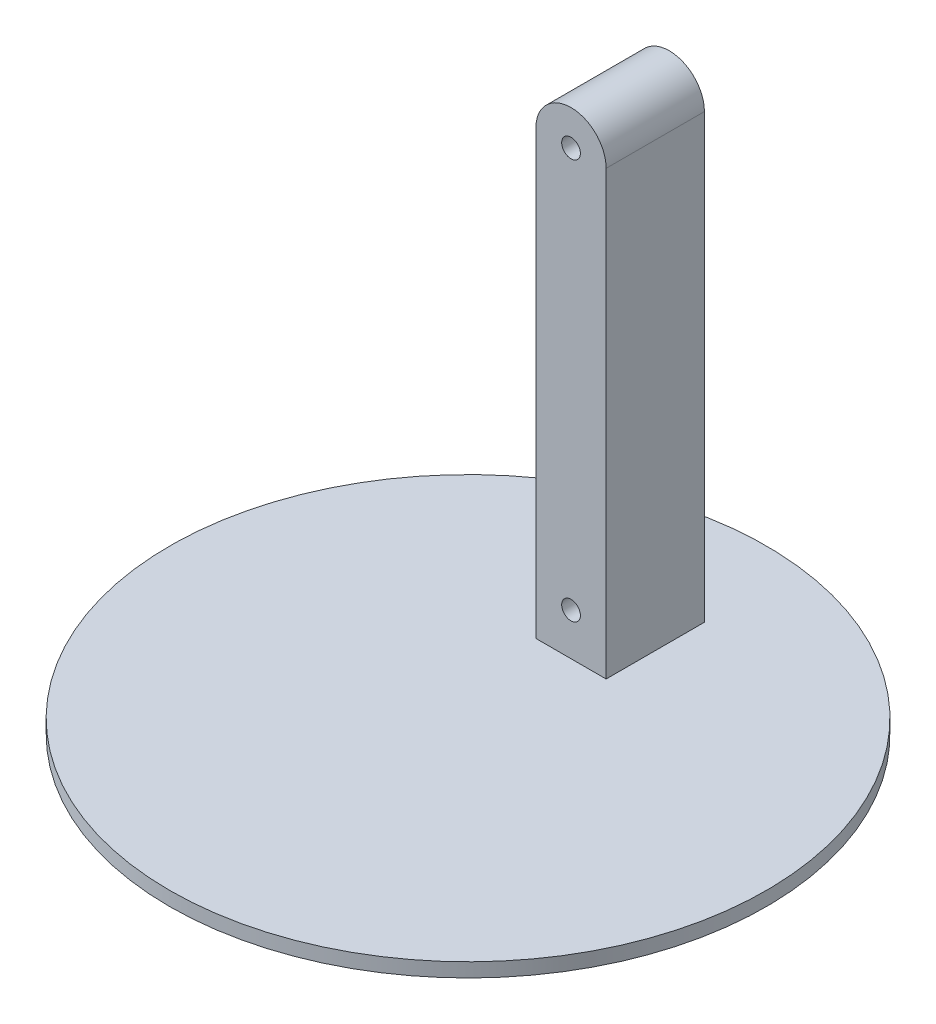
ISO-10303-21;
HEADER;
FILE_DESCRIPTION(('STEP AP214'),'2;1');
FILE_NAME('part.step','',(''),(''),'','','');
FILE_SCHEMA(('AUTOMOTIVE_DESIGN { 1 0 10303 214 1 1 1 1 }'));
ENDSEC;
DATA;
#1=APPLICATION_CONTEXT('core data for automotive mechanical design processes');
#2=APPLICATION_PROTOCOL_DEFINITION('international standard','automotive_design',2000,#1);
#3=PRODUCT_CONTEXT('',#1,'mechanical');
#4=PRODUCT('Part','Part','',(#3));
#5=PRODUCT_RELATED_PRODUCT_CATEGORY('part','',(#4));
#6=PRODUCT_DEFINITION_FORMATION('','',#4);
#7=PRODUCT_DEFINITION_CONTEXT('part definition',#1,'design');
#8=PRODUCT_DEFINITION('design','',#6,#7);
#9=PRODUCT_DEFINITION_SHAPE('','',#8);
#10=(LENGTH_UNIT() NAMED_UNIT(*) SI_UNIT(.MILLI.,.METRE.));
#11=(NAMED_UNIT(*) PLANE_ANGLE_UNIT() SI_UNIT($,.RADIAN.));
#12=(NAMED_UNIT(*) SI_UNIT($,.STERADIAN.) SOLID_ANGLE_UNIT());
#13=UNCERTAINTY_MEASURE_WITH_UNIT(LENGTH_MEASURE(1.E-05),#10,'distance_accuracy_value','');
#14=(GEOMETRIC_REPRESENTATION_CONTEXT(3) GLOBAL_UNCERTAINTY_ASSIGNED_CONTEXT((#13)) GLOBAL_UNIT_ASSIGNED_CONTEXT((#10,
#11,#12)) REPRESENTATION_CONTEXT('',''));
#15=CARTESIAN_POINT('',(0.,0.,0.));
#16=DIRECTION('',(0.,0.,1.));
#17=DIRECTION('',(1.,0.,0.));
#18=AXIS2_PLACEMENT_3D('',#15,#16,#17);
#19=CARTESIAN_POINT('',(0.,-189.,0.));
#20=DIRECTION('',(0.,1.,0.));
#21=DIRECTION('',(0.,0.,1.));
#22=AXIS2_PLACEMENT_3D('',#19,#20,#21);
#23=PLANE('',#22);
#24=CARTESIAN_POINT('',(0.,-189.,0.));
#25=DIRECTION('',(0.,1.,0.));
#26=DIRECTION('',(0.,0.,1.));
#27=AXIS2_PLACEMENT_3D('',#24,#25,#26);
#28=CIRCLE('',#27,127.5);
#29=CARTESIAN_POINT('',(0.,-189.,127.5));
#30=VERTEX_POINT('',#29);
#31=EDGE_CURVE('E11',#30,#30,#28,.T.);
#32=ORIENTED_EDGE('',*,*,#31,.T.);
#33=EDGE_LOOP('',(#32));
#34=FACE_BOUND('',#33,.T.);
#35=DIRECTION('',(1.,0.,0.));
#36=VECTOR('',#35,1.);
#37=CARTESIAN_POINT('',(-15.,-189.,-44.));
#38=LINE('',#37,#36);
#39=CARTESIAN_POINT('',(-15.,-189.,-44.));
#40=VERTEX_POINT('',#39);
#41=CARTESIAN_POINT('',(15.,-189.,-44.));
#42=VERTEX_POINT('',#41);
#43=EDGE_CURVE('E95',#40,#42,#38,.T.);
#44=ORIENTED_EDGE('',*,*,#43,.F.);
#45=DIRECTION('',(0.,0.,-1.));
#46=VECTOR('',#45,1.);
#47=CARTESIAN_POINT('',(-15.,-189.,-44.));
#48=LINE('',#47,#46);
#49=CARTESIAN_POINT('',(-15.,-189.,-86.));
#50=VERTEX_POINT('',#49);
#51=EDGE_CURVE('E92',#40,#50,#48,.T.);
#52=ORIENTED_EDGE('',*,*,#51,.T.);
#53=DIRECTION('',(1.,0.,0.));
#54=VECTOR('',#53,1.);
#55=CARTESIAN_POINT('',(-15.,-189.,-86.));
#56=LINE('',#55,#54);
#57=CARTESIAN_POINT('',(15.,-189.,-86.));
#58=VERTEX_POINT('',#57);
#59=EDGE_CURVE('E122',#50,#58,#56,.T.);
#60=ORIENTED_EDGE('',*,*,#59,.T.);
#61=DIRECTION('',(0.,0.,-1.));
#62=VECTOR('',#61,1.);
#63=CARTESIAN_POINT('',(15.,-189.,-44.));
#64=LINE('',#63,#62);
#65=EDGE_CURVE('E112',#42,#58,#64,.T.);
#66=ORIENTED_EDGE('',*,*,#65,.F.);
#67=EDGE_LOOP('',(#44,#52,#60,#66));
#68=FACE_BOUND('',#67,.T.);
#69=ADVANCED_FACE('F43',(#34,#68),#23,.T.);
#70=CARTESIAN_POINT('',(0.,-189.,0.));
#71=DIRECTION('',(0.,-1.,0.));
#72=DIRECTION('',(0.,0.,-1.));
#73=AXIS2_PLACEMENT_3D('',#70,#71,#72);
#74=CYLINDRICAL_SURFACE('',#73,127.5);
#75=ORIENTED_EDGE('',*,*,#31,.F.);
#76=EDGE_LOOP('',(#75));
#77=FACE_BOUND('',#76,.T.);
#78=CARTESIAN_POINT('',(0.,-195.,0.));
#79=DIRECTION('',(0.,1.,0.));
#80=DIRECTION('',(0.,0.,1.));
#81=AXIS2_PLACEMENT_3D('',#78,#79,#80);
#82=CIRCLE('',#81,127.5);
#83=CARTESIAN_POINT('',(0.,-195.,127.5));
#84=VERTEX_POINT('',#83);
#85=EDGE_CURVE('E47',#84,#84,#82,.T.);
#86=ORIENTED_EDGE('',*,*,#85,.T.);
#87=EDGE_LOOP('',(#86));
#88=FACE_BOUND('',#87,.T.);
#89=ADVANCED_FACE('F45',(#77,#88),#74,.T.);
#90=CARTESIAN_POINT('',(0.,-195.,0.));
#91=DIRECTION('',(0.,1.,0.));
#92=DIRECTION('',(0.,0.,1.));
#93=AXIS2_PLACEMENT_3D('',#90,#91,#92);
#94=PLANE('',#93);
#95=ORIENTED_EDGE('',*,*,#85,.F.);
#96=EDGE_LOOP('',(#95));
#97=FACE_BOUND('',#96,.T.);
#98=ADVANCED_FACE('F156',(#97),#94,.F.);
#99=CARTESIAN_POINT('',(0.,0.,-44.));
#100=DIRECTION('',(0.,0.,1.));
#101=DIRECTION('',(1.,0.,0.));
#102=AXIS2_PLACEMENT_3D('',#99,#100,#101);
#103=PLANE('',#102);
#104=CARTESIAN_POINT('',(0.,0.,-44.));
#105=DIRECTION('',(0.,0.,1.));
#106=DIRECTION('',(1.,0.,0.));
#107=AXIS2_PLACEMENT_3D('',#104,#105,#106);
#108=CIRCLE('',#107,4.);
#109=CARTESIAN_POINT('',(-4.,0.,-44.));
#110=VERTEX_POINT('',#109);
#111=EDGE_CURVE('E131',#110,#110,#108,.T.);
#112=ORIENTED_EDGE('',*,*,#111,.F.);
#113=EDGE_LOOP('',(#112));
#114=FACE_BOUND('',#113,.T.);
#115=CARTESIAN_POINT('',(0.,0.,-44.));
#116=DIRECTION('',(0.,0.,1.));
#117=DIRECTION('',(1.,0.,0.));
#118=AXIS2_PLACEMENT_3D('',#115,#116,#117);
#119=CIRCLE('',#118,15.);
#120=CARTESIAN_POINT('',(15.,0.,-44.));
#121=VERTEX_POINT('',#120);
#122=CARTESIAN_POINT('',(-15.,0.,-44.));
#123=VERTEX_POINT('',#122);
#124=EDGE_CURVE('E96',#121,#123,#119,.T.);
#125=ORIENTED_EDGE('',*,*,#124,.T.);
#126=DIRECTION('',(0.,-1.,0.));
#127=VECTOR('',#126,1.);
#128=CARTESIAN_POINT('',(-15.,0.,-44.));
#129=LINE('',#128,#127);
#130=EDGE_CURVE('E86',#123,#40,#129,.T.);
#131=ORIENTED_EDGE('',*,*,#130,.T.);
#132=ORIENTED_EDGE('',*,*,#43,.T.);
#133=DIRECTION('',(0.,1.,0.));
#134=VECTOR('',#133,1.);
#135=CARTESIAN_POINT('',(15.,-189.,-44.));
#136=LINE('',#135,#134);
#137=EDGE_CURVE('E59',#42,#121,#136,.T.);
#138=ORIENTED_EDGE('',*,*,#137,.T.);
#139=EDGE_LOOP('',(#125,#131,#132,#138));
#140=FACE_BOUND('',#139,.T.);
#141=CARTESIAN_POINT('',(0.,-171.,-44.));
#142=DIRECTION('',(0.,0.,1.));
#143=DIRECTION('',(1.,0.,0.));
#144=AXIS2_PLACEMENT_3D('',#141,#142,#143);
#145=CIRCLE('',#144,4.);
#146=CARTESIAN_POINT('',(-4.,-171.,-44.));
#147=VERTEX_POINT('',#146);
#148=EDGE_CURVE('E140',#147,#147,#145,.T.);
#149=ORIENTED_EDGE('',*,*,#148,.F.);
#150=EDGE_LOOP('',(#149));
#151=FACE_BOUND('',#150,.T.);
#152=ADVANCED_FACE('F99',(#114,#140,#151),#103,.T.);
#153=CARTESIAN_POINT('',(0.,0.,-86.));
#154=DIRECTION('',(0.,0.,1.));
#155=DIRECTION('',(1.,0.,0.));
#156=AXIS2_PLACEMENT_3D('',#153,#154,#155);
#157=PLANE('',#156);
#158=CARTESIAN_POINT('',(0.,0.,-86.));
#159=DIRECTION('',(0.,0.,1.));
#160=DIRECTION('',(1.,0.,0.));
#161=AXIS2_PLACEMENT_3D('',#158,#159,#160);
#162=CIRCLE('',#161,15.);
#163=CARTESIAN_POINT('',(15.,0.,-86.));
#164=VERTEX_POINT('',#163);
#165=CARTESIAN_POINT('',(-15.,0.,-86.));
#166=VERTEX_POINT('',#165);
#167=EDGE_CURVE('E106',#164,#166,#162,.T.);
#168=ORIENTED_EDGE('',*,*,#167,.F.);
#169=DIRECTION('',(0.,1.,0.));
#170=VECTOR('',#169,1.);
#171=CARTESIAN_POINT('',(15.,-189.,-86.));
#172=LINE('',#171,#170);
#173=EDGE_CURVE('E80',#58,#164,#172,.T.);
#174=ORIENTED_EDGE('',*,*,#173,.F.);
#175=ORIENTED_EDGE('',*,*,#59,.F.);
#176=DIRECTION('',(0.,-1.,0.));
#177=VECTOR('',#176,1.);
#178=CARTESIAN_POINT('',(-15.,0.,-86.));
#179=LINE('',#178,#177);
#180=EDGE_CURVE('E126',#166,#50,#179,.T.);
#181=ORIENTED_EDGE('',*,*,#180,.F.);
#182=EDGE_LOOP('',(#168,#174,#175,#181));
#183=FACE_BOUND('',#182,.T.);
#184=CARTESIAN_POINT('',(0.,0.,-86.));
#185=DIRECTION('',(0.,0.,1.));
#186=DIRECTION('',(1.,0.,0.));
#187=AXIS2_PLACEMENT_3D('',#184,#185,#186);
#188=CIRCLE('',#187,4.);
#189=CARTESIAN_POINT('',(-4.,0.,-86.));
#190=VERTEX_POINT('',#189);
#191=EDGE_CURVE('E136',#190,#190,#188,.T.);
#192=ORIENTED_EDGE('',*,*,#191,.T.);
#193=EDGE_LOOP('',(#192));
#194=FACE_BOUND('',#193,.T.);
#195=CARTESIAN_POINT('',(0.,-171.,-86.));
#196=DIRECTION('',(0.,0.,1.));
#197=DIRECTION('',(1.,0.,0.));
#198=AXIS2_PLACEMENT_3D('',#195,#196,#197);
#199=CIRCLE('',#198,4.);
#200=CARTESIAN_POINT('',(-4.,-171.,-86.));
#201=VERTEX_POINT('',#200);
#202=EDGE_CURVE('E144',#201,#201,#199,.T.);
#203=ORIENTED_EDGE('',*,*,#202,.T.);
#204=EDGE_LOOP('',(#203));
#205=FACE_BOUND('',#204,.T.);
#206=ADVANCED_FACE('F155',(#183,#194,#205),#157,.F.);
#207=CARTESIAN_POINT('',(0.,0.,-44.));
#208=DIRECTION('',(0.,0.,-1.));
#209=DIRECTION('',(-1.,0.,0.));
#210=AXIS2_PLACEMENT_3D('',#207,#208,#209);
#211=CYLINDRICAL_SURFACE('',#210,15.);
#212=ORIENTED_EDGE('',*,*,#167,.T.);
#213=DIRECTION('',(0.,0.,-1.));
#214=VECTOR('',#213,1.);
#215=CARTESIAN_POINT('',(-15.,0.,-44.));
#216=LINE('',#215,#214);
#217=EDGE_CURVE('E89',#123,#166,#216,.T.);
#218=ORIENTED_EDGE('',*,*,#217,.F.);
#219=ORIENTED_EDGE('',*,*,#124,.F.);
#220=DIRECTION('',(0.,0.,-1.));
#221=VECTOR('',#220,1.);
#222=CARTESIAN_POINT('',(15.,0.,-44.));
#223=LINE('',#222,#221);
#224=EDGE_CURVE('E117',#121,#164,#223,.T.);
#225=ORIENTED_EDGE('',*,*,#224,.T.);
#226=EDGE_LOOP('',(#212,#218,#219,#225));
#227=FACE_BOUND('',#226,.T.);
#228=ADVANCED_FACE('F104',(#227),#211,.T.);
#229=CARTESIAN_POINT('',(-15.,0.,-44.));
#230=DIRECTION('',(1.,0.,0.));
#231=DIRECTION('',(0.,1.,0.));
#232=AXIS2_PLACEMENT_3D('',#229,#230,#231);
#233=PLANE('',#232);
#234=ORIENTED_EDGE('',*,*,#180,.T.);
#235=ORIENTED_EDGE('',*,*,#51,.F.);
#236=ORIENTED_EDGE('',*,*,#130,.F.);
#237=ORIENTED_EDGE('',*,*,#217,.T.);
#238=EDGE_LOOP('',(#234,#235,#236,#237));
#239=FACE_BOUND('',#238,.T.);
#240=ADVANCED_FACE('F87',(#239),#233,.F.);
#241=CARTESIAN_POINT('',(15.,-189.,-44.));
#242=DIRECTION('',(-1.,0.,0.));
#243=DIRECTION('',(0.,-1.,0.));
#244=AXIS2_PLACEMENT_3D('',#241,#242,#243);
#245=PLANE('',#244);
#246=ORIENTED_EDGE('',*,*,#173,.T.);
#247=ORIENTED_EDGE('',*,*,#224,.F.);
#248=ORIENTED_EDGE('',*,*,#137,.F.);
#249=ORIENTED_EDGE('',*,*,#65,.T.);
#250=EDGE_LOOP('',(#246,#247,#248,#249));
#251=FACE_BOUND('',#250,.T.);
#252=ADVANCED_FACE('F181',(#251),#245,.F.);
#253=CARTESIAN_POINT('',(0.,0.,-44.));
#254=DIRECTION('',(0.,0.,-1.));
#255=DIRECTION('',(-1.,0.,0.));
#256=AXIS2_PLACEMENT_3D('',#253,#254,#255);
#257=CYLINDRICAL_SURFACE('',#256,4.);
#258=CARTESIAN_POINT('',(-4.,0.,-44.));
#259=CARTESIAN_POINT('',(-4.,0.,-44.4375));
#260=CARTESIAN_POINT('',(-4.,0.,-44.875));
#261=CARTESIAN_POINT('',(-4.,0.,-45.75));
#262=CARTESIAN_POINT('',(-4.,0.,-46.1875));
#263=CARTESIAN_POINT('',(-4.,0.,-47.0625));
#264=CARTESIAN_POINT('',(-4.,0.,-47.5));
#265=CARTESIAN_POINT('',(-4.,0.,-48.375));
#266=CARTESIAN_POINT('',(-4.,0.,-48.8125));
#267=CARTESIAN_POINT('',(-4.,0.,-49.6875));
#268=CARTESIAN_POINT('',(-4.,0.,-50.125));
#269=CARTESIAN_POINT('',(-4.,0.,-51.));
#270=CARTESIAN_POINT('',(-4.,0.,-51.4375));
#271=CARTESIAN_POINT('',(-4.,0.,-52.3125));
#272=CARTESIAN_POINT('',(-4.,0.,-52.75));
#273=CARTESIAN_POINT('',(-4.,0.,-53.625));
#274=CARTESIAN_POINT('',(-4.,0.,-54.0625));
#275=CARTESIAN_POINT('',(-4.,0.,-54.9375));
#276=CARTESIAN_POINT('',(-4.,0.,-55.375));
#277=CARTESIAN_POINT('',(-4.,0.,-56.25));
#278=CARTESIAN_POINT('',(-4.,0.,-56.6875));
#279=CARTESIAN_POINT('',(-4.,0.,-57.5625));
#280=CARTESIAN_POINT('',(-4.,0.,-58.));
#281=CARTESIAN_POINT('',(-4.,0.,-58.875));
#282=CARTESIAN_POINT('',(-4.,0.,-59.3125));
#283=CARTESIAN_POINT('',(-4.,0.,-60.1875));
#284=CARTESIAN_POINT('',(-4.,0.,-60.625));
#285=CARTESIAN_POINT('',(-4.,0.,-61.5));
#286=CARTESIAN_POINT('',(-4.,0.,-61.9375));
#287=CARTESIAN_POINT('',(-4.,0.,-62.8125));
#288=CARTESIAN_POINT('',(-4.,0.,-63.25));
#289=CARTESIAN_POINT('',(-4.,0.,-64.125));
#290=CARTESIAN_POINT('',(-4.,0.,-64.5625));
#291=CARTESIAN_POINT('',(-4.,0.,-65.4375));
#292=CARTESIAN_POINT('',(-4.,0.,-65.875));
#293=CARTESIAN_POINT('',(-4.,0.,-66.75));
#294=CARTESIAN_POINT('',(-4.,0.,-67.1875));
#295=CARTESIAN_POINT('',(-4.,0.,-68.0625));
#296=CARTESIAN_POINT('',(-4.,0.,-68.5));
#297=CARTESIAN_POINT('',(-4.,0.,-69.375));
#298=CARTESIAN_POINT('',(-4.,0.,-69.8125));
#299=CARTESIAN_POINT('',(-4.,0.,-70.6875));
#300=CARTESIAN_POINT('',(-4.,0.,-71.125));
#301=CARTESIAN_POINT('',(-4.,0.,-72.));
#302=CARTESIAN_POINT('',(-4.,0.,-72.4375));
#303=CARTESIAN_POINT('',(-4.,0.,-73.3125));
#304=CARTESIAN_POINT('',(-4.,0.,-73.75));
#305=CARTESIAN_POINT('',(-4.,0.,-74.625));
#306=CARTESIAN_POINT('',(-4.,0.,-75.0625));
#307=CARTESIAN_POINT('',(-4.,0.,-75.9375));
#308=CARTESIAN_POINT('',(-4.,0.,-76.375));
#309=CARTESIAN_POINT('',(-4.,0.,-77.25));
#310=CARTESIAN_POINT('',(-4.,0.,-77.6875));
#311=CARTESIAN_POINT('',(-4.,0.,-78.5625));
#312=CARTESIAN_POINT('',(-4.,0.,-79.));
#313=CARTESIAN_POINT('',(-4.,0.,-79.875));
#314=CARTESIAN_POINT('',(-4.,0.,-80.3125));
#315=CARTESIAN_POINT('',(-4.,0.,-81.1875));
#316=CARTESIAN_POINT('',(-4.,0.,-81.625));
#317=CARTESIAN_POINT('',(-4.,0.,-82.5));
#318=CARTESIAN_POINT('',(-4.,0.,-82.9375));
#319=CARTESIAN_POINT('',(-4.,0.,-83.8125));
#320=CARTESIAN_POINT('',(-4.,0.,-84.25));
#321=CARTESIAN_POINT('',(-4.,0.,-85.125));
#322=CARTESIAN_POINT('',(-4.,0.,-85.5625));
#323=CARTESIAN_POINT('',(-4.,0.,-86.));
#324=B_SPLINE_CURVE_WITH_KNOTS('',3,(#258,#259,#260,#261,#262,#263,#264,#265,#266,#267,#268,
#269,#270,#271,#272,#273,#274,#275,#276,#277,#278,#279,#280,#281,#282,#283,#284,#285,#286,#287,
#288,#289,#290,#291,#292,#293,#294,#295,#296,#297,#298,#299,#300,#301,#302,#303,#304,#305,#306,
#307,#308,#309,#310,#311,#312,#313,#314,#315,#316,#317,#318,#319,#320,#321,#322,#323),
.UNSPECIFIED.,.F.,.F.,(4,2,2,2,2,2,2,2,2,2,2,2,2,2,2,2,2,2,2,2,2,2,2,2,2,2,2,2,2,2,2,2,4),(0.,
1.3125,2.625,3.9375,5.25,6.56250000000001,7.875,9.1875,10.5,11.8125,13.125,14.4375,15.75,
17.0625,18.375,19.6875,21.,22.3125,23.625,24.9375,26.25,27.5625,28.875,30.1875,31.5,32.8125,
34.125,35.4375,36.75,38.0625,39.375,40.6875,42.),.UNSPECIFIED.);
#325=EDGE_CURVE('BSEAM183',#110,#190,#324,.T.);
#326=ORIENTED_EDGE('',*,*,#111,.T.);
#327=ORIENTED_EDGE('',*,*,#191,.F.);
#328=ORIENTED_EDGE('',*,*,#325,.T.);
#329=ORIENTED_EDGE('',*,*,#325,.F.);
#330=EDGE_LOOP('',(#326,#328,#327,#329));
#331=FACE_BOUND('',#330,.T.);
#332=ADVANCED_FACE('F183',(#331),#257,.F.);
#333=CARTESIAN_POINT('',(0.,-171.,-44.));
#334=DIRECTION('',(0.,0.,-1.));
#335=DIRECTION('',(-1.,0.,0.));
#336=AXIS2_PLACEMENT_3D('',#333,#334,#335);
#337=CYLINDRICAL_SURFACE('',#336,4.);
#338=CARTESIAN_POINT('',(-4.,-171.,-44.));
#339=CARTESIAN_POINT('',(-4.,-171.,-44.4375));
#340=CARTESIAN_POINT('',(-4.,-171.,-44.875));
#341=CARTESIAN_POINT('',(-4.,-171.,-45.75));
#342=CARTESIAN_POINT('',(-4.,-171.,-46.1875));
#343=CARTESIAN_POINT('',(-4.,-171.,-47.0625));
#344=CARTESIAN_POINT('',(-4.,-171.,-47.5));
#345=CARTESIAN_POINT('',(-4.,-171.,-48.375));
#346=CARTESIAN_POINT('',(-4.,-171.,-48.8125));
#347=CARTESIAN_POINT('',(-4.,-171.,-49.6875));
#348=CARTESIAN_POINT('',(-4.,-171.,-50.125));
#349=CARTESIAN_POINT('',(-4.,-171.,-51.));
#350=CARTESIAN_POINT('',(-4.,-171.,-51.4375));
#351=CARTESIAN_POINT('',(-4.,-171.,-52.3125));
#352=CARTESIAN_POINT('',(-4.,-171.,-52.75));
#353=CARTESIAN_POINT('',(-4.,-171.,-53.625));
#354=CARTESIAN_POINT('',(-4.,-171.,-54.0625));
#355=CARTESIAN_POINT('',(-4.,-171.,-54.9375));
#356=CARTESIAN_POINT('',(-4.,-171.,-55.375));
#357=CARTESIAN_POINT('',(-4.,-171.,-56.25));
#358=CARTESIAN_POINT('',(-4.,-171.,-56.6875));
#359=CARTESIAN_POINT('',(-4.,-171.,-57.5625));
#360=CARTESIAN_POINT('',(-4.,-171.,-58.));
#361=CARTESIAN_POINT('',(-4.,-171.,-58.875));
#362=CARTESIAN_POINT('',(-4.,-171.,-59.3125));
#363=CARTESIAN_POINT('',(-4.,-171.,-60.1875));
#364=CARTESIAN_POINT('',(-4.,-171.,-60.625));
#365=CARTESIAN_POINT('',(-4.,-171.,-61.5));
#366=CARTESIAN_POINT('',(-4.,-171.,-61.9375));
#367=CARTESIAN_POINT('',(-4.,-171.,-62.8125));
#368=CARTESIAN_POINT('',(-4.,-171.,-63.25));
#369=CARTESIAN_POINT('',(-4.,-171.,-64.125));
#370=CARTESIAN_POINT('',(-4.,-171.,-64.5625));
#371=CARTESIAN_POINT('',(-4.,-171.,-65.4375));
#372=CARTESIAN_POINT('',(-4.,-171.,-65.875));
#373=CARTESIAN_POINT('',(-4.,-171.,-66.75));
#374=CARTESIAN_POINT('',(-4.,-171.,-67.1875));
#375=CARTESIAN_POINT('',(-4.,-171.,-68.0625));
#376=CARTESIAN_POINT('',(-4.,-171.,-68.5));
#377=CARTESIAN_POINT('',(-4.,-171.,-69.375));
#378=CARTESIAN_POINT('',(-4.,-171.,-69.8125));
#379=CARTESIAN_POINT('',(-4.,-171.,-70.6875));
#380=CARTESIAN_POINT('',(-4.,-171.,-71.125));
#381=CARTESIAN_POINT('',(-4.,-171.,-72.));
#382=CARTESIAN_POINT('',(-4.,-171.,-72.4375));
#383=CARTESIAN_POINT('',(-4.,-171.,-73.3125));
#384=CARTESIAN_POINT('',(-4.,-171.,-73.75));
#385=CARTESIAN_POINT('',(-4.,-171.,-74.625));
#386=CARTESIAN_POINT('',(-4.,-171.,-75.0625));
#387=CARTESIAN_POINT('',(-4.,-171.,-75.9375));
#388=CARTESIAN_POINT('',(-4.,-171.,-76.375));
#389=CARTESIAN_POINT('',(-4.,-171.,-77.25));
#390=CARTESIAN_POINT('',(-4.,-171.,-77.6875));
#391=CARTESIAN_POINT('',(-4.,-171.,-78.5625));
#392=CARTESIAN_POINT('',(-4.,-171.,-79.));
#393=CARTESIAN_POINT('',(-4.,-171.,-79.875));
#394=CARTESIAN_POINT('',(-4.,-171.,-80.3125));
#395=CARTESIAN_POINT('',(-4.,-171.,-81.1875));
#396=CARTESIAN_POINT('',(-4.,-171.,-81.625));
#397=CARTESIAN_POINT('',(-4.,-171.,-82.5));
#398=CARTESIAN_POINT('',(-4.,-171.,-82.9375));
#399=CARTESIAN_POINT('',(-4.,-171.,-83.8125));
#400=CARTESIAN_POINT('',(-4.,-171.,-84.25));
#401=CARTESIAN_POINT('',(-4.,-171.,-85.125));
#402=CARTESIAN_POINT('',(-4.,-171.,-85.5625));
#403=CARTESIAN_POINT('',(-4.,-171.,-86.));
#404=B_SPLINE_CURVE_WITH_KNOTS('',3,(#338,#339,#340,#341,#342,#343,#344,#345,#346,#347,#348,
#349,#350,#351,#352,#353,#354,#355,#356,#357,#358,#359,#360,#361,#362,#363,#364,#365,#366,#367,
#368,#369,#370,#371,#372,#373,#374,#375,#376,#377,#378,#379,#380,#381,#382,#383,#384,#385,#386,
#387,#388,#389,#390,#391,#392,#393,#394,#395,#396,#397,#398,#399,#400,#401,#402,#403),
.UNSPECIFIED.,.F.,.F.,(4,2,2,2,2,2,2,2,2,2,2,2,2,2,2,2,2,2,2,2,2,2,2,2,2,2,2,2,2,2,2,2,4),(0.,
1.3125,2.625,3.9375,5.25,6.56250000000001,7.875,9.1875,10.5,11.8125,13.125,14.4375,15.75,
17.0625,18.375,19.6875,21.,22.3125,23.625,24.9375,26.25,27.5625,28.875,30.1875,31.5,32.8125,
34.125,35.4375,36.75,38.0625,39.375,40.6875,42.),.UNSPECIFIED.);
#405=EDGE_CURVE('BSEAM152',#147,#201,#404,.T.);
#406=ORIENTED_EDGE('',*,*,#148,.T.);
#407=ORIENTED_EDGE('',*,*,#202,.F.);
#408=ORIENTED_EDGE('',*,*,#405,.T.);
#409=ORIENTED_EDGE('',*,*,#405,.F.);
#410=EDGE_LOOP('',(#406,#408,#407,#409));
#411=FACE_BOUND('',#410,.T.);
#412=ADVANCED_FACE('F152',(#411),#337,.F.);
#413=CLOSED_SHELL('',(#69,#89,#98,#152,#206,#228,#240,#252,#332,#412));
#414=MANIFOLD_SOLID_BREP('B2',#413);
#415=ADVANCED_BREP_SHAPE_REPRESENTATION('',(#18,#414),#14);
#416=SHAPE_DEFINITION_REPRESENTATION(#9,#415);
ENDSEC;
END-ISO-10303-21;
